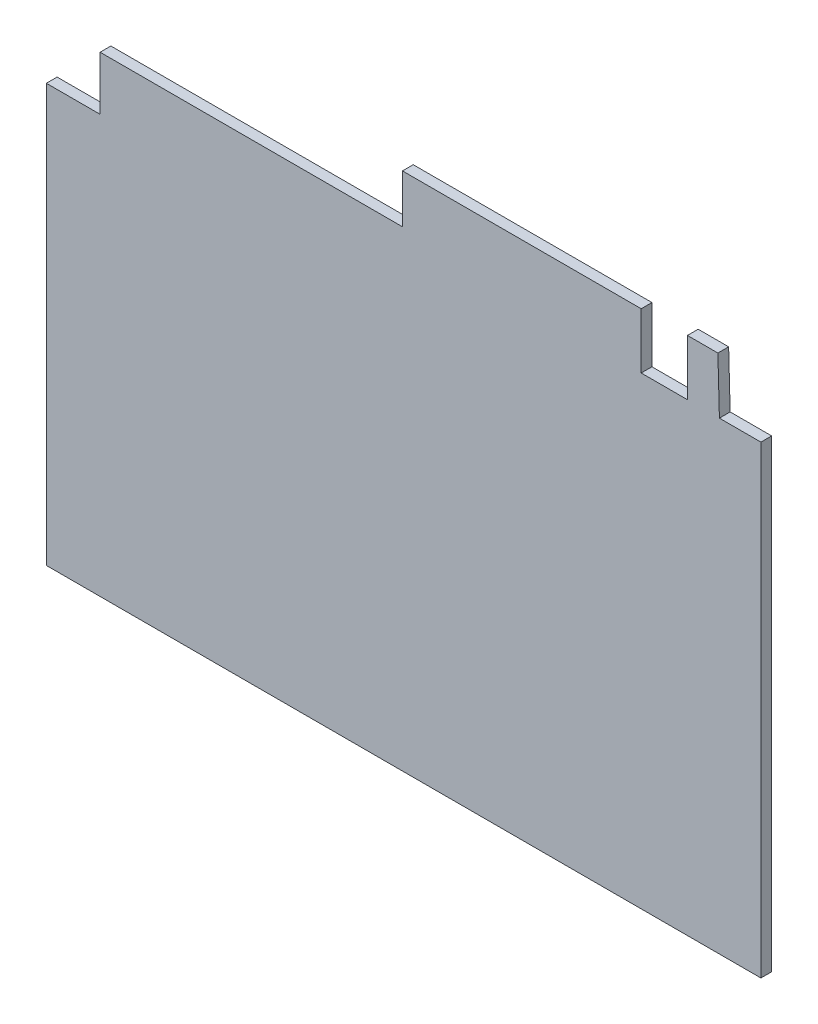
ISO-10303-21;
HEADER;
FILE_DESCRIPTION(('STEP AP214'),'2;1');
FILE_NAME('part.step','',(''),(''),'','','');
FILE_SCHEMA(('AUTOMOTIVE_DESIGN { 1 0 10303 214 1 1 1 1 }'));
ENDSEC;
DATA;
#1=APPLICATION_CONTEXT('core data for automotive mechanical design processes');
#2=APPLICATION_PROTOCOL_DEFINITION('international standard','automotive_design',2000,#1);
#3=PRODUCT_CONTEXT('',#1,'mechanical');
#4=PRODUCT('Part','Part','',(#3));
#5=PRODUCT_RELATED_PRODUCT_CATEGORY('part','',(#4));
#6=PRODUCT_DEFINITION_FORMATION('','',#4);
#7=PRODUCT_DEFINITION_CONTEXT('part definition',#1,'design');
#8=PRODUCT_DEFINITION('design','',#6,#7);
#9=PRODUCT_DEFINITION_SHAPE('','',#8);
#10=(LENGTH_UNIT() NAMED_UNIT(*) SI_UNIT(.MILLI.,.METRE.));
#11=(NAMED_UNIT(*) PLANE_ANGLE_UNIT() SI_UNIT($,.RADIAN.));
#12=(NAMED_UNIT(*) SI_UNIT($,.STERADIAN.) SOLID_ANGLE_UNIT());
#13=UNCERTAINTY_MEASURE_WITH_UNIT(LENGTH_MEASURE(1.E-05),#10,'distance_accuracy_value','');
#14=(GEOMETRIC_REPRESENTATION_CONTEXT(3) GLOBAL_UNCERTAINTY_ASSIGNED_CONTEXT((#13)) GLOBAL_UNIT_ASSIGNED_CONTEXT((#10,
#11,#12)) REPRESENTATION_CONTEXT('',''));
#15=CARTESIAN_POINT('',(0.,0.,0.));
#16=DIRECTION('',(0.,0.,1.));
#17=DIRECTION('',(1.,0.,0.));
#18=AXIS2_PLACEMENT_3D('',#15,#16,#17);
#19=CARTESIAN_POINT('',(28.5714285714286,236.06020224505,6.));
#20=DIRECTION('',(-1.,0.,0.));
#21=DIRECTION('',(0.,0.,1.));
#22=AXIS2_PLACEMENT_3D('',#19,#20,#21);
#23=PLANE('',#22);
#24=DIRECTION('',(0.,1.,0.));
#25=VECTOR('',#24,1.);
#26=CARTESIAN_POINT('',(28.5714285714282,-22.8952380952381,6.));
#27=LINE('',#26,#25);
#28=CARTESIAN_POINT('',(28.5714285714282,-21.8952380952382,6.));
#29=VERTEX_POINT('',#28);
#30=CARTESIAN_POINT('',(28.5714285714286,237.051840480238,6.));
#31=VERTEX_POINT('',#30);
#32=EDGE_CURVE('E142',#29,#31,#27,.T.);
#33=ORIENTED_EDGE('',*,*,#32,.F.);
#34=DIRECTION('',(0.,0.,1.));
#35=VECTOR('',#34,1.);
#36=CARTESIAN_POINT('',(28.5714285714282,-21.8952380952382,-4.));
#37=LINE('',#36,#35);
#38=CARTESIAN_POINT('',(28.5714285714282,-21.8952380952382,0.));
#39=VERTEX_POINT('',#38);
#40=EDGE_CURVE('E131',#39,#29,#37,.T.);
#41=ORIENTED_EDGE('',*,*,#40,.F.);
#42=DIRECTION('',(0.,1.,0.));
#43=VECTOR('',#42,1.);
#44=CARTESIAN_POINT('',(28.5714285714286,236.06020224505,0.));
#45=LINE('',#44,#43);
#46=CARTESIAN_POINT('',(28.5714285714286,237.051840480238,0.));
#47=VERTEX_POINT('',#46);
#48=EDGE_CURVE('E181',#39,#47,#45,.T.);
#49=ORIENTED_EDGE('',*,*,#48,.T.);
#50=DIRECTION('',(0.,0.,-1.));
#51=VECTOR('',#50,1.);
#52=CARTESIAN_POINT('',(28.5714285714286,237.051840480238,6.));
#53=LINE('',#52,#51);
#54=EDGE_CURVE('E149',#31,#47,#53,.T.);
#55=ORIENTED_EDGE('',*,*,#54,.F.);
#56=EDGE_LOOP('',(#33,#41,#49,#55));
#57=FACE_BOUND('',#56,.T.);
#58=ADVANCED_FACE('F34',(#57),#23,.F.);
#59=CARTESIAN_POINT('',(28.5714285714286,237.051840480238,6.));
#60=DIRECTION('',(0.,-1.,0.));
#61=DIRECTION('',(0.,0.,-1.));
#62=AXIS2_PLACEMENT_3D('',#59,#60,#61);
#63=PLANE('',#62);
#64=DIRECTION('',(-1.,0.,0.));
#65=VECTOR('',#64,1.);
#66=CARTESIAN_POINT('',(28.5714285714286,237.051840480238,0.));
#67=LINE('',#66,#65);
#68=CARTESIAN_POINT('',(5.41548643614652,237.051840480238,0.));
#69=VERTEX_POINT('',#68);
#70=EDGE_CURVE('E183',#47,#69,#67,.T.);
#71=ORIENTED_EDGE('',*,*,#70,.T.);
#72=DIRECTION('',(0.,0.,-1.));
#73=VECTOR('',#72,1.);
#74=CARTESIAN_POINT('',(5.41548643614652,237.051840480238,6.));
#75=LINE('',#74,#73);
#76=CARTESIAN_POINT('',(5.41548643614652,237.051840480238,6.));
#77=VERTEX_POINT('',#76);
#78=EDGE_CURVE('E222',#77,#69,#75,.T.);
#79=ORIENTED_EDGE('',*,*,#78,.F.);
#80=DIRECTION('',(-1.,0.,0.));
#81=VECTOR('',#80,1.);
#82=CARTESIAN_POINT('',(28.5714285714286,237.051840480238,6.));
#83=LINE('',#82,#81);
#84=EDGE_CURVE('E151',#31,#77,#83,.T.);
#85=ORIENTED_EDGE('',*,*,#84,.F.);
#86=ORIENTED_EDGE('',*,*,#54,.T.);
#87=EDGE_LOOP('',(#71,#79,#85,#86));
#88=FACE_BOUND('',#87,.T.);
#89=ADVANCED_FACE('F276',(#88),#63,.F.);
#90=CARTESIAN_POINT('',(5.41548643614652,237.051840480238,6.));
#91=DIRECTION('',(-0.99963079383079,-0.0271712352539165,0.));
#92=DIRECTION('',(0.0271712352539165,-0.99963079383079,0.));
#93=AXIS2_PLACEMENT_3D('',#90,#91,#92);
#94=PLANE('',#93);
#95=DIRECTION('',(-0.0271712352539165,0.999630793830791,0.));
#96=VECTOR('',#95,1.);
#97=CARTESIAN_POINT('',(5.41548643614652,237.051840480238,0.));
#98=LINE('',#97,#96);
#99=CARTESIAN_POINT('',(4.57142857142857,268.104761904762,0.));
#100=VERTEX_POINT('',#99);
#101=EDGE_CURVE('E186',#69,#100,#98,.T.);
#102=ORIENTED_EDGE('',*,*,#101,.T.);
#103=DIRECTION('',(0.,0.,-1.));
#104=VECTOR('',#103,1.);
#105=CARTESIAN_POINT('',(4.57142857142857,268.104761904762,6.));
#106=LINE('',#105,#104);
#107=CARTESIAN_POINT('',(4.57142857142857,268.104761904762,6.));
#108=VERTEX_POINT('',#107);
#109=EDGE_CURVE('E219',#108,#100,#106,.T.);
#110=ORIENTED_EDGE('',*,*,#109,.F.);
#111=DIRECTION('',(-0.0271712352539165,0.999630793830791,0.));
#112=VECTOR('',#111,1.);
#113=CARTESIAN_POINT('',(5.41548643614652,237.051840480238,6.));
#114=LINE('',#113,#112);
#115=EDGE_CURVE('E154',#77,#108,#114,.T.);
#116=ORIENTED_EDGE('',*,*,#115,.F.);
#117=ORIENTED_EDGE('',*,*,#78,.T.);
#118=EDGE_LOOP('',(#102,#110,#116,#117));
#119=FACE_BOUND('',#118,.T.);
#120=ADVANCED_FACE('F272',(#119),#94,.F.);
#121=CARTESIAN_POINT('',(4.57142857142857,268.104761904762,6.));
#122=DIRECTION('',(0.,-1.,0.));
#123=DIRECTION('',(0.,0.,-1.));
#124=AXIS2_PLACEMENT_3D('',#121,#122,#123);
#125=PLANE('',#124);
#126=DIRECTION('',(-1.,0.,0.));
#127=VECTOR('',#126,1.);
#128=CARTESIAN_POINT('',(4.57142857142857,268.104761904762,0.));
#129=LINE('',#128,#127);
#130=CARTESIAN_POINT('',(-12.4285714285714,268.104761904762,0.));
#131=VERTEX_POINT('',#130);
#132=EDGE_CURVE('E188',#100,#131,#129,.T.);
#133=ORIENTED_EDGE('',*,*,#132,.T.);
#134=DIRECTION('',(0.,0.,-1.));
#135=VECTOR('',#134,1.);
#136=CARTESIAN_POINT('',(-12.4285714285714,268.104761904762,6.));
#137=LINE('',#136,#135);
#138=CARTESIAN_POINT('',(-12.4285714285714,268.104761904762,6.));
#139=VERTEX_POINT('',#138);
#140=EDGE_CURVE('E216',#139,#131,#137,.T.);
#141=ORIENTED_EDGE('',*,*,#140,.F.);
#142=DIRECTION('',(-1.,0.,0.));
#143=VECTOR('',#142,1.);
#144=CARTESIAN_POINT('',(4.57142857142857,268.104761904762,6.));
#145=LINE('',#144,#143);
#146=EDGE_CURVE('E164',#108,#139,#145,.T.);
#147=ORIENTED_EDGE('',*,*,#146,.F.);
#148=ORIENTED_EDGE('',*,*,#109,.T.);
#149=EDGE_LOOP('',(#133,#141,#147,#148));
#150=FACE_BOUND('',#149,.T.);
#151=ADVANCED_FACE('F268',(#150),#125,.F.);
#152=CARTESIAN_POINT('',(-12.4285714285714,268.104761904762,6.));
#153=DIRECTION('',(1.,0.,0.));
#154=DIRECTION('',(0.,0.,-1.));
#155=AXIS2_PLACEMENT_3D('',#152,#153,#154);
#156=PLANE('',#155);
#157=DIRECTION('',(0.,-1.,0.));
#158=VECTOR('',#157,1.);
#159=CARTESIAN_POINT('',(-12.4285714285714,268.104761904762,0.));
#160=LINE('',#159,#158);
#161=CARTESIAN_POINT('',(-12.4285714285714,237.051840480238,0.));
#162=VERTEX_POINT('',#161);
#163=EDGE_CURVE('E190',#131,#162,#160,.T.);
#164=ORIENTED_EDGE('',*,*,#163,.T.);
#165=DIRECTION('',(0.,0.,-1.));
#166=VECTOR('',#165,1.);
#167=CARTESIAN_POINT('',(-12.4285714285714,237.051840480238,6.));
#168=LINE('',#167,#166);
#169=CARTESIAN_POINT('',(-12.4285714285714,237.051840480238,6.));
#170=VERTEX_POINT('',#169);
#171=EDGE_CURVE('E213',#170,#162,#168,.T.);
#172=ORIENTED_EDGE('',*,*,#171,.F.);
#173=DIRECTION('',(0.,-1.,0.));
#174=VECTOR('',#173,1.);
#175=CARTESIAN_POINT('',(-12.4285714285714,268.104761904762,6.));
#176=LINE('',#175,#174);
#177=EDGE_CURVE('E166',#139,#170,#176,.T.);
#178=ORIENTED_EDGE('',*,*,#177,.F.);
#179=ORIENTED_EDGE('',*,*,#140,.T.);
#180=EDGE_LOOP('',(#164,#172,#178,#179));
#181=FACE_BOUND('',#180,.T.);
#182=ADVANCED_FACE('F263',(#181),#156,.F.);
#183=CARTESIAN_POINT('',(-12.4285714285714,237.051840480238,6.));
#184=DIRECTION('',(0.,-1.,0.));
#185=DIRECTION('',(0.,0.,-1.));
#186=AXIS2_PLACEMENT_3D('',#183,#184,#185);
#187=PLANE('',#186);
#188=DIRECTION('',(-1.,0.,0.));
#189=VECTOR('',#188,1.);
#190=CARTESIAN_POINT('',(-12.4285714285714,237.051840480238,0.));
#191=LINE('',#190,#189);
#192=CARTESIAN_POINT('',(-38.2165959121275,237.051840480238,0.));
#193=VERTEX_POINT('',#192);
#194=EDGE_CURVE('E192',#162,#193,#191,.T.);
#195=ORIENTED_EDGE('',*,*,#194,.T.);
#196=DIRECTION('',(0.,0.,-1.));
#197=VECTOR('',#196,1.);
#198=CARTESIAN_POINT('',(-38.2165959121275,237.051840480238,6.));
#199=LINE('',#198,#197);
#200=CARTESIAN_POINT('',(-38.2165959121275,237.051840480238,6.));
#201=VERTEX_POINT('',#200);
#202=EDGE_CURVE('E210',#201,#193,#199,.T.);
#203=ORIENTED_EDGE('',*,*,#202,.F.);
#204=DIRECTION('',(-1.,0.,0.));
#205=VECTOR('',#204,1.);
#206=CARTESIAN_POINT('',(-12.4285714285714,237.051840480238,6.));
#207=LINE('',#206,#205);
#208=EDGE_CURVE('E168',#170,#201,#207,.T.);
#209=ORIENTED_EDGE('',*,*,#208,.F.);
#210=ORIENTED_EDGE('',*,*,#171,.T.);
#211=EDGE_LOOP('',(#195,#203,#209,#210));
#212=FACE_BOUND('',#211,.T.);
#213=ADVANCED_FACE('F257',(#212),#187,.F.);
#214=CARTESIAN_POINT('',(-38.2165959121275,237.051840480238,6.));
#215=DIRECTION('',(-1.,0.,0.));
#216=DIRECTION('',(0.,-1.,0.));
#217=AXIS2_PLACEMENT_3D('',#214,#215,#216);
#218=PLANE('',#217);
#219=DIRECTION('',(0.,1.,0.));
#220=VECTOR('',#219,1.);
#221=CARTESIAN_POINT('',(-38.2165959121275,237.051840480238,0.));
#222=LINE('',#221,#220);
#223=CARTESIAN_POINT('',(-38.2165959121275,268.104761904762,0.));
#224=VERTEX_POINT('',#223);
#225=EDGE_CURVE('E194',#193,#224,#222,.T.);
#226=ORIENTED_EDGE('',*,*,#225,.T.);
#227=DIRECTION('',(0.,0.,-1.));
#228=VECTOR('',#227,1.);
#229=CARTESIAN_POINT('',(-38.2165959121275,268.104761904762,6.));
#230=LINE('',#229,#228);
#231=CARTESIAN_POINT('',(-38.2165959121275,268.104761904762,6.));
#232=VERTEX_POINT('',#231);
#233=EDGE_CURVE('E207',#232,#224,#230,.T.);
#234=ORIENTED_EDGE('',*,*,#233,.F.);
#235=DIRECTION('',(0.,1.,0.));
#236=VECTOR('',#235,1.);
#237=CARTESIAN_POINT('',(-38.2165959121275,237.051840480238,6.));
#238=LINE('',#237,#236);
#239=EDGE_CURVE('E170',#201,#232,#238,.T.);
#240=ORIENTED_EDGE('',*,*,#239,.F.);
#241=ORIENTED_EDGE('',*,*,#202,.T.);
#242=EDGE_LOOP('',(#226,#234,#240,#241));
#243=FACE_BOUND('',#242,.T.);
#244=ADVANCED_FACE('F253',(#243),#218,.F.);
#245=CARTESIAN_POINT('',(-38.2165959121275,268.104761904762,6.));
#246=DIRECTION('',(0.,-1.,0.));
#247=DIRECTION('',(1.,0.,0.));
#248=AXIS2_PLACEMENT_3D('',#245,#246,#247);
#249=PLANE('',#248);
#250=DIRECTION('',(-1.,0.,0.));
#251=VECTOR('',#250,1.);
#252=CARTESIAN_POINT('',(-38.2165959121275,268.104761904762,0.));
#253=LINE('',#252,#251);
#254=CARTESIAN_POINT('',(-171.428571428571,268.104761904762,0.));
#255=VERTEX_POINT('',#254);
#256=EDGE_CURVE('E196',#224,#255,#253,.T.);
#257=ORIENTED_EDGE('',*,*,#256,.T.);
#258=DIRECTION('',(0.,0.,-1.));
#259=VECTOR('',#258,1.);
#260=CARTESIAN_POINT('',(-171.428571428571,268.104761904762,6.));
#261=LINE('',#260,#259);
#262=CARTESIAN_POINT('',(-171.428571428571,268.104761904762,6.));
#263=VERTEX_POINT('',#262);
#264=EDGE_CURVE('E204',#263,#255,#261,.T.);
#265=ORIENTED_EDGE('',*,*,#264,.F.);
#266=DIRECTION('',(-1.,0.,0.));
#267=VECTOR('',#266,1.);
#268=CARTESIAN_POINT('',(-38.2165959121275,268.104761904762,6.));
#269=LINE('',#268,#267);
#270=EDGE_CURVE('E172',#232,#263,#269,.T.);
#271=ORIENTED_EDGE('',*,*,#270,.F.);
#272=ORIENTED_EDGE('',*,*,#233,.T.);
#273=EDGE_LOOP('',(#257,#265,#271,#272));
#274=FACE_BOUND('',#273,.T.);
#275=ADVANCED_FACE('F248',(#274),#249,.F.);
#276=CARTESIAN_POINT('',(-171.428571428571,268.104761904762,6.));
#277=DIRECTION('',(1.,0.,0.));
#278=DIRECTION('',(0.,1.,0.));
#279=AXIS2_PLACEMENT_3D('',#276,#277,#278);
#280=PLANE('',#279);
#281=DIRECTION('',(0.,-1.,0.));
#282=VECTOR('',#281,1.);
#283=CARTESIAN_POINT('',(-171.428571428571,268.104761904762,0.));
#284=LINE('',#283,#282);
#285=CARTESIAN_POINT('',(-171.428571428571,241.104761904762,0.));
#286=VERTEX_POINT('',#285);
#287=EDGE_CURVE('E198',#255,#286,#284,.T.);
#288=ORIENTED_EDGE('',*,*,#287,.T.);
#289=DIRECTION('',(0.,0.,-1.));
#290=VECTOR('',#289,1.);
#291=CARTESIAN_POINT('',(-171.428571428571,241.104761904762,6.));
#292=LINE('',#291,#290);
#293=CARTESIAN_POINT('',(-171.428571428571,241.104761904762,6.));
#294=VERTEX_POINT('',#293);
#295=EDGE_CURVE('E180',#294,#286,#292,.T.);
#296=ORIENTED_EDGE('',*,*,#295,.F.);
#297=DIRECTION('',(0.,-1.,0.));
#298=VECTOR('',#297,1.);
#299=CARTESIAN_POINT('',(-171.428571428571,268.104761904762,6.));
#300=LINE('',#299,#298);
#301=EDGE_CURVE('E174',#263,#294,#300,.T.);
#302=ORIENTED_EDGE('',*,*,#301,.F.);
#303=ORIENTED_EDGE('',*,*,#264,.T.);
#304=EDGE_LOOP('',(#288,#296,#302,#303));
#305=FACE_BOUND('',#304,.T.);
#306=ADVANCED_FACE('F242',(#305),#280,.F.);
#307=CARTESIAN_POINT('',(-171.428571428571,241.104761904762,6.));
#308=DIRECTION('',(0.,-1.,0.));
#309=DIRECTION('',(1.,0.,0.));
#310=AXIS2_PLACEMENT_3D('',#307,#308,#309);
#311=PLANE('',#310);
#312=DIRECTION('',(-1.,0.,0.));
#313=VECTOR('',#312,1.);
#314=CARTESIAN_POINT('',(-171.428571428571,241.104761904762,0.));
#315=LINE('',#314,#313);
#316=CARTESIAN_POINT('',(-340.123537573958,241.104761904762,0.));
#317=VERTEX_POINT('',#316);
#318=EDGE_CURVE('E157',#286,#317,#315,.T.);
#319=ORIENTED_EDGE('',*,*,#318,.T.);
#320=DIRECTION('',(0.,0.,1.));
#321=VECTOR('',#320,1.);
#322=CARTESIAN_POINT('',(-340.123537573958,241.104761904762,-4.));
#323=LINE('',#322,#321);
#324=CARTESIAN_POINT('',(-340.123537573958,241.104761904762,6.));
#325=VERTEX_POINT('',#324);
#326=EDGE_CURVE('E184',#317,#325,#323,.T.);
#327=ORIENTED_EDGE('',*,*,#326,.T.);
#328=DIRECTION('',(-1.,0.,0.));
#329=VECTOR('',#328,1.);
#330=CARTESIAN_POINT('',(-171.428571428571,241.104761904762,6.));
#331=LINE('',#330,#329);
#332=EDGE_CURVE('E176',#294,#325,#331,.T.);
#333=ORIENTED_EDGE('',*,*,#332,.F.);
#334=ORIENTED_EDGE('',*,*,#295,.T.);
#335=EDGE_LOOP('',(#319,#327,#333,#334));
#336=FACE_BOUND('',#335,.T.);
#337=ADVANCED_FACE('F237',(#336),#311,.F.);
#338=CARTESIAN_POINT('',(-370.123537573958,241.104761904762,6.));
#339=DIRECTION('',(1.,0.,0.));
#340=DIRECTION('',(0.,1.,0.));
#341=AXIS2_PLACEMENT_3D('',#338,#339,#340);
#342=PLANE('',#341);
#343=DIRECTION('',(0.,-1.,0.));
#344=VECTOR('',#343,1.);
#345=CARTESIAN_POINT('',(-370.123537573958,241.104761904762,0.));
#346=LINE('',#345,#344);
#347=CARTESIAN_POINT('',(-370.123537573958,211.104761904762,0.));
#348=VERTEX_POINT('',#347);
#349=CARTESIAN_POINT('',(-370.123537573958,-21.8952380952382,0.));
#350=VERTEX_POINT('',#349);
#351=EDGE_CURVE('E152',#348,#350,#346,.T.);
#352=ORIENTED_EDGE('',*,*,#351,.T.);
#353=DIRECTION('',(0.,0.,1.));
#354=VECTOR('',#353,1.);
#355=CARTESIAN_POINT('',(-370.123537573958,-21.8952380952382,-4.));
#356=LINE('',#355,#354);
#357=CARTESIAN_POINT('',(-370.123537573958,-21.8952380952382,6.));
#358=VERTEX_POINT('',#357);
#359=EDGE_CURVE('E48',#350,#358,#356,.T.);
#360=ORIENTED_EDGE('',*,*,#359,.T.);
#361=DIRECTION('',(0.,-1.,0.));
#362=VECTOR('',#361,1.);
#363=CARTESIAN_POINT('',(-370.123537573958,241.104761904762,6.));
#364=LINE('',#363,#362);
#365=CARTESIAN_POINT('',(-370.123537573958,211.104761904762,6.));
#366=VERTEX_POINT('',#365);
#367=EDGE_CURVE('E146',#366,#358,#364,.T.);
#368=ORIENTED_EDGE('',*,*,#367,.F.);
#369=DIRECTION('',(0.,0.,1.));
#370=VECTOR('',#369,1.);
#371=CARTESIAN_POINT('',(-370.123537573958,211.104761904762,-4.));
#372=LINE('',#371,#370);
#373=EDGE_CURVE('E160',#348,#366,#372,.T.);
#374=ORIENTED_EDGE('',*,*,#373,.F.);
#375=EDGE_LOOP('',(#352,#360,#368,#374));
#376=FACE_BOUND('',#375,.T.);
#377=ADVANCED_FACE('F287',(#376),#342,.F.);
#378=CARTESIAN_POINT('',(0.,0.,6.));
#379=DIRECTION('',(0.,0.,1.));
#380=DIRECTION('',(1.,0.,0.));
#381=AXIS2_PLACEMENT_3D('',#378,#379,#380);
#382=PLANE('',#381);
#383=DIRECTION('',(-1.,0.,0.));
#384=VECTOR('',#383,1.);
#385=CARTESIAN_POINT('',(-370.123537573958,-21.8952380952382,6.));
#386=LINE('',#385,#384);
#387=EDGE_CURVE('E134',#29,#358,#386,.T.);
#388=ORIENTED_EDGE('',*,*,#387,.F.);
#389=ORIENTED_EDGE('',*,*,#32,.T.);
#390=ORIENTED_EDGE('',*,*,#84,.T.);
#391=ORIENTED_EDGE('',*,*,#115,.T.);
#392=ORIENTED_EDGE('',*,*,#146,.T.);
#393=ORIENTED_EDGE('',*,*,#177,.T.);
#394=ORIENTED_EDGE('',*,*,#208,.T.);
#395=ORIENTED_EDGE('',*,*,#239,.T.);
#396=ORIENTED_EDGE('',*,*,#270,.T.);
#397=ORIENTED_EDGE('',*,*,#301,.T.);
#398=ORIENTED_EDGE('',*,*,#332,.T.);
#399=DIRECTION('',(0.,1.,0.));
#400=VECTOR('',#399,1.);
#401=CARTESIAN_POINT('',(-340.123537573958,241.104761904762,6.));
#402=LINE('',#401,#400);
#403=CARTESIAN_POINT('',(-340.123537573958,211.104761904762,6.));
#404=VERTEX_POINT('',#403);
#405=EDGE_CURVE('E278',#404,#325,#402,.T.);
#406=ORIENTED_EDGE('',*,*,#405,.F.);
#407=DIRECTION('',(1.,0.,0.));
#408=VECTOR('',#407,1.);
#409=CARTESIAN_POINT('',(-370.123537573958,211.104761904762,6.));
#410=LINE('',#409,#408);
#411=EDGE_CURVE('E279',#366,#404,#410,.T.);
#412=ORIENTED_EDGE('',*,*,#411,.F.);
#413=ORIENTED_EDGE('',*,*,#367,.T.);
#414=EDGE_LOOP('',(#388,#389,#390,#391,#392,#393,#394,#395,#396,#397,#398,#406,#412,#413));
#415=FACE_BOUND('',#414,.T.);
#416=ADVANCED_FACE('F141',(#415),#382,.T.);
#417=CARTESIAN_POINT('',(0.,0.,0.));
#418=DIRECTION('',(0.,0.,1.));
#419=DIRECTION('',(1.,0.,0.));
#420=AXIS2_PLACEMENT_3D('',#417,#418,#419);
#421=PLANE('',#420);
#422=ORIENTED_EDGE('',*,*,#48,.F.);
#423=DIRECTION('',(-1.,0.,0.));
#424=VECTOR('',#423,1.);
#425=CARTESIAN_POINT('',(0.,-21.8952380952382,0.));
#426=LINE('',#425,#424);
#427=EDGE_CURVE('E11',#39,#350,#426,.T.);
#428=ORIENTED_EDGE('',*,*,#427,.T.);
#429=ORIENTED_EDGE('',*,*,#351,.F.);
#430=DIRECTION('',(1.,0.,0.));
#431=VECTOR('',#430,1.);
#432=CARTESIAN_POINT('',(0.,211.104761904762,0.));
#433=LINE('',#432,#431);
#434=CARTESIAN_POINT('',(-340.123537573958,211.104761904762,0.));
#435=VERTEX_POINT('',#434);
#436=EDGE_CURVE('E226',#348,#435,#433,.T.);
#437=ORIENTED_EDGE('',*,*,#436,.T.);
#438=DIRECTION('',(0.,1.,0.));
#439=VECTOR('',#438,1.);
#440=CARTESIAN_POINT('',(-340.123537573958,0.,0.));
#441=LINE('',#440,#439);
#442=EDGE_CURVE('E41',#435,#317,#441,.T.);
#443=ORIENTED_EDGE('',*,*,#442,.T.);
#444=ORIENTED_EDGE('',*,*,#318,.F.);
#445=ORIENTED_EDGE('',*,*,#287,.F.);
#446=ORIENTED_EDGE('',*,*,#256,.F.);
#447=ORIENTED_EDGE('',*,*,#225,.F.);
#448=ORIENTED_EDGE('',*,*,#194,.F.);
#449=ORIENTED_EDGE('',*,*,#163,.F.);
#450=ORIENTED_EDGE('',*,*,#132,.F.);
#451=ORIENTED_EDGE('',*,*,#101,.F.);
#452=ORIENTED_EDGE('',*,*,#70,.F.);
#453=EDGE_LOOP('',(#422,#428,#429,#437,#443,#444,#445,#446,#447,#448,#449,#450,#451,#452));
#454=FACE_BOUND('',#453,.T.);
#455=ADVANCED_FACE('F231',(#454),#421,.F.);
#456=CARTESIAN_POINT('',(-340.123537573958,241.104761904762,-4.));
#457=DIRECTION('',(1.,0.,0.));
#458=DIRECTION('',(0.,0.,-1.));
#459=AXIS2_PLACEMENT_3D('',#456,#457,#458);
#460=PLANE('',#459);
#461=DIRECTION('',(0.,0.,1.));
#462=VECTOR('',#461,1.);
#463=CARTESIAN_POINT('',(-340.123537573958,211.104761904762,-4.));
#464=LINE('',#463,#462);
#465=EDGE_CURVE('E55',#435,#404,#464,.T.);
#466=ORIENTED_EDGE('',*,*,#465,.T.);
#467=ORIENTED_EDGE('',*,*,#405,.T.);
#468=ORIENTED_EDGE('',*,*,#326,.F.);
#469=ORIENTED_EDGE('',*,*,#442,.F.);
#470=EDGE_LOOP('',(#466,#467,#468,#469));
#471=FACE_BOUND('',#470,.T.);
#472=ADVANCED_FACE('F283',(#471),#460,.F.);
#473=CARTESIAN_POINT('',(-370.123537573958,211.104761904762,-4.));
#474=DIRECTION('',(0.,-1.,0.));
#475=DIRECTION('',(0.,0.,-1.));
#476=AXIS2_PLACEMENT_3D('',#473,#474,#475);
#477=PLANE('',#476);
#478=ORIENTED_EDGE('',*,*,#373,.T.);
#479=ORIENTED_EDGE('',*,*,#411,.T.);
#480=ORIENTED_EDGE('',*,*,#465,.F.);
#481=ORIENTED_EDGE('',*,*,#436,.F.);
#482=EDGE_LOOP('',(#478,#479,#480,#481));
#483=FACE_BOUND('',#482,.T.);
#484=ADVANCED_FACE('F284',(#483),#477,.F.);
#485=CARTESIAN_POINT('',(-370.123537573958,-21.8952380952382,-4.));
#486=DIRECTION('',(0.,1.,0.));
#487=DIRECTION('',(0.,0.,1.));
#488=AXIS2_PLACEMENT_3D('',#485,#486,#487);
#489=PLANE('',#488);
#490=ORIENTED_EDGE('',*,*,#40,.T.);
#491=ORIENTED_EDGE('',*,*,#387,.T.);
#492=ORIENTED_EDGE('',*,*,#359,.F.);
#493=ORIENTED_EDGE('',*,*,#427,.F.);
#494=EDGE_LOOP('',(#490,#491,#492,#493));
#495=FACE_BOUND('',#494,.T.);
#496=ADVANCED_FACE('F133',(#495),#489,.F.);
#497=CLOSED_SHELL('',(#58,#89,#120,#151,#182,#213,#244,#275,#306,#337,#377,#416,#455,#472,#484,#496));
#498=MANIFOLD_SOLID_BREP('B2',#497);
#499=ADVANCED_BREP_SHAPE_REPRESENTATION('',(#18,#498),#14);
#500=SHAPE_DEFINITION_REPRESENTATION(#9,#499);
ENDSEC;
END-ISO-10303-21;
